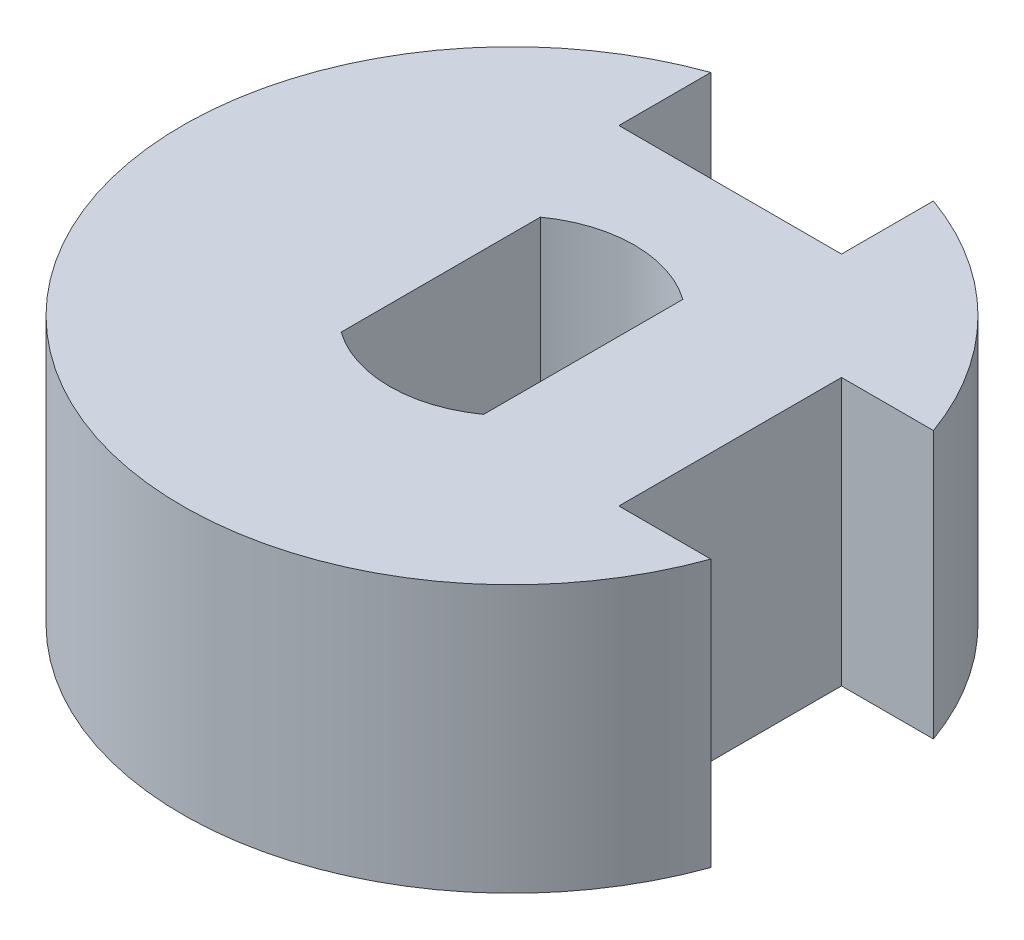
ISO-10303-21;
HEADER;
FILE_DESCRIPTION(('STEP AP214'),'2;1');
FILE_NAME('part.step','',(''),(''),'','','');
FILE_SCHEMA(('AUTOMOTIVE_DESIGN { 1 0 10303 214 1 1 1 1 }'));
ENDSEC;
DATA;
#1=APPLICATION_CONTEXT('core data for automotive mechanical design processes');
#2=APPLICATION_PROTOCOL_DEFINITION('international standard','automotive_design',2000,#1);
#3=PRODUCT_CONTEXT('',#1,'mechanical');
#4=PRODUCT('Part','Part','',(#3));
#5=PRODUCT_RELATED_PRODUCT_CATEGORY('part','',(#4));
#6=PRODUCT_DEFINITION_FORMATION('','',#4);
#7=PRODUCT_DEFINITION_CONTEXT('part definition',#1,'design');
#8=PRODUCT_DEFINITION('design','',#6,#7);
#9=PRODUCT_DEFINITION_SHAPE('','',#8);
#10=(LENGTH_UNIT() NAMED_UNIT(*) SI_UNIT(.MILLI.,.METRE.));
#11=(NAMED_UNIT(*) PLANE_ANGLE_UNIT() SI_UNIT($,.RADIAN.));
#12=(NAMED_UNIT(*) SI_UNIT($,.STERADIAN.) SOLID_ANGLE_UNIT());
#13=UNCERTAINTY_MEASURE_WITH_UNIT(LENGTH_MEASURE(1.E-05),#10,'distance_accuracy_value','');
#14=(GEOMETRIC_REPRESENTATION_CONTEXT(3) GLOBAL_UNCERTAINTY_ASSIGNED_CONTEXT((#13)) GLOBAL_UNIT_ASSIGNED_CONTEXT((#10,
#11,#12)) REPRESENTATION_CONTEXT('',''));
#15=CARTESIAN_POINT('',(0.,0.,0.));
#16=DIRECTION('',(0.,0.,1.));
#17=DIRECTION('',(1.,0.,0.));
#18=AXIS2_PLACEMENT_3D('',#15,#16,#17);
#19=CARTESIAN_POINT('',(0.,6.,-2.5));
#20=DIRECTION('',(0.,0.,-1.));
#21=DIRECTION('',(-1.,0.,0.));
#22=AXIS2_PLACEMENT_3D('',#19,#20,#21);
#23=PLANE('',#22);
#24=DIRECTION('',(1.,0.,0.));
#25=VECTOR('',#24,1.);
#26=CARTESIAN_POINT('',(0.,0.,-2.5));
#27=LINE('',#26,#25);
#28=CARTESIAN_POINT('',(4.9,0.,-2.5));
#29=VERTEX_POINT('',#28);
#30=CARTESIAN_POINT('',(6.96491205974634,0.,-2.5));
#31=VERTEX_POINT('',#30);
#32=EDGE_CURVE('E179',#29,#31,#27,.T.);
#33=ORIENTED_EDGE('',*,*,#32,.T.);
#34=DIRECTION('',(0.,-1.,0.));
#35=VECTOR('',#34,1.);
#36=CARTESIAN_POINT('',(6.96491205974634,6.,-2.5));
#37=LINE('',#36,#35);
#38=CARTESIAN_POINT('',(6.96491205974634,6.,-2.5));
#39=VERTEX_POINT('',#38);
#40=EDGE_CURVE('E11',#39,#31,#37,.T.);
#41=ORIENTED_EDGE('',*,*,#40,.F.);
#42=DIRECTION('',(1.,0.,0.));
#43=VECTOR('',#42,1.);
#44=CARTESIAN_POINT('',(0.,6.,-2.5));
#45=LINE('',#44,#43);
#46=CARTESIAN_POINT('',(4.9,6.,-2.5));
#47=VERTEX_POINT('',#46);
#48=EDGE_CURVE('E232',#47,#39,#45,.T.);
#49=ORIENTED_EDGE('',*,*,#48,.F.);
#50=DIRECTION('',(0.,-1.,0.));
#51=VECTOR('',#50,1.);
#52=CARTESIAN_POINT('',(4.9,6.,-2.5));
#53=LINE('',#52,#51);
#54=EDGE_CURVE('E58',#47,#29,#53,.T.);
#55=ORIENTED_EDGE('',*,*,#54,.T.);
#56=EDGE_LOOP('',(#33,#41,#49,#55));
#57=FACE_BOUND('',#56,.T.);
#58=ADVANCED_FACE('F39',(#57),#23,.F.);
#59=CARTESIAN_POINT('',(0.,6.,0.));
#60=DIRECTION('',(0.,-1.,0.));
#61=DIRECTION('',(0.,0.,-1.));
#62=AXIS2_PLACEMENT_3D('',#59,#60,#61);
#63=CYLINDRICAL_SURFACE('',#62,7.4);
#64=CARTESIAN_POINT('',(0.,0.,0.));
#65=DIRECTION('',(0.,1.,0.));
#66=DIRECTION('',(0.,0.,1.));
#67=AXIS2_PLACEMENT_3D('',#64,#65,#66);
#68=CIRCLE('',#67,7.4);
#69=CARTESIAN_POINT('',(2.5,0.,-6.96491205974634));
#70=VERTEX_POINT('',#69);
#71=EDGE_CURVE('E181',#31,#70,#68,.T.);
#72=ORIENTED_EDGE('',*,*,#71,.T.);
#73=DIRECTION('',(0.,-1.,0.));
#74=VECTOR('',#73,1.);
#75=CARTESIAN_POINT('',(2.5,6.,-6.96491205974634));
#76=LINE('',#75,#74);
#77=CARTESIAN_POINT('',(2.5,6.,-6.96491205974634));
#78=VERTEX_POINT('',#77);
#79=EDGE_CURVE('E49',#78,#70,#76,.T.);
#80=ORIENTED_EDGE('',*,*,#79,.F.);
#81=CARTESIAN_POINT('',(0.,6.,0.));
#82=DIRECTION('',(0.,1.,0.));
#83=DIRECTION('',(0.,0.,1.));
#84=AXIS2_PLACEMENT_3D('',#81,#82,#83);
#85=CIRCLE('',#84,7.4);
#86=EDGE_CURVE('E149',#39,#78,#85,.T.);
#87=ORIENTED_EDGE('',*,*,#86,.F.);
#88=ORIENTED_EDGE('',*,*,#40,.T.);
#89=EDGE_LOOP('',(#72,#80,#87,#88));
#90=FACE_BOUND('',#89,.T.);
#91=ADVANCED_FACE('F259',(#90),#63,.T.);
#92=CARTESIAN_POINT('',(2.5,6.,0.));
#93=DIRECTION('',(1.,0.,0.));
#94=DIRECTION('',(0.,0.,-1.));
#95=AXIS2_PLACEMENT_3D('',#92,#93,#94);
#96=PLANE('',#95);
#97=DIRECTION('',(0.,0.,1.));
#98=VECTOR('',#97,1.);
#99=CARTESIAN_POINT('',(2.5,0.,0.));
#100=LINE('',#99,#98);
#101=CARTESIAN_POINT('',(2.5,0.,-4.9));
#102=VERTEX_POINT('',#101);
#103=EDGE_CURVE('E183',#70,#102,#100,.T.);
#104=ORIENTED_EDGE('',*,*,#103,.T.);
#105=DIRECTION('',(0.,-1.,0.));
#106=VECTOR('',#105,1.);
#107=CARTESIAN_POINT('',(2.5,6.,-4.9));
#108=LINE('',#107,#106);
#109=CARTESIAN_POINT('',(2.5,6.,-4.9));
#110=VERTEX_POINT('',#109);
#111=EDGE_CURVE('E203',#110,#102,#108,.T.);
#112=ORIENTED_EDGE('',*,*,#111,.F.);
#113=DIRECTION('',(0.,0.,1.));
#114=VECTOR('',#113,1.);
#115=CARTESIAN_POINT('',(2.5,6.,0.));
#116=LINE('',#115,#114);
#117=EDGE_CURVE('E239',#78,#110,#116,.T.);
#118=ORIENTED_EDGE('',*,*,#117,.F.);
#119=ORIENTED_EDGE('',*,*,#79,.T.);
#120=EDGE_LOOP('',(#104,#112,#118,#119));
#121=FACE_BOUND('',#120,.T.);
#122=ADVANCED_FACE('F264',(#121),#96,.F.);
#123=CARTESIAN_POINT('',(0.,6.,-4.9));
#124=DIRECTION('',(0.,0.,-1.));
#125=DIRECTION('',(-1.,0.,0.));
#126=AXIS2_PLACEMENT_3D('',#123,#124,#125);
#127=PLANE('',#126);
#128=DIRECTION('',(1.,0.,0.));
#129=VECTOR('',#128,1.);
#130=CARTESIAN_POINT('',(0.,0.,-4.9));
#131=LINE('',#130,#129);
#132=CARTESIAN_POINT('',(-2.5,0.,-4.9));
#133=VERTEX_POINT('',#132);
#134=EDGE_CURVE('E186',#133,#102,#131,.T.);
#135=ORIENTED_EDGE('',*,*,#134,.F.);
#136=DIRECTION('',(0.,-1.,0.));
#137=VECTOR('',#136,1.);
#138=CARTESIAN_POINT('',(-2.5,6.,-4.9));
#139=LINE('',#138,#137);
#140=CARTESIAN_POINT('',(-2.5,6.,-4.9));
#141=VERTEX_POINT('',#140);
#142=EDGE_CURVE('E201',#141,#133,#139,.T.);
#143=ORIENTED_EDGE('',*,*,#142,.F.);
#144=DIRECTION('',(1.,0.,0.));
#145=VECTOR('',#144,1.);
#146=CARTESIAN_POINT('',(0.,6.,-4.9));
#147=LINE('',#146,#145);
#148=EDGE_CURVE('E240',#141,#110,#147,.T.);
#149=ORIENTED_EDGE('',*,*,#148,.T.);
#150=ORIENTED_EDGE('',*,*,#111,.T.);
#151=EDGE_LOOP('',(#135,#143,#149,#150));
#152=FACE_BOUND('',#151,.T.);
#153=ADVANCED_FACE('F283',(#152),#127,.T.);
#154=CARTESIAN_POINT('',(-2.5,6.,0.));
#155=DIRECTION('',(1.,0.,0.));
#156=DIRECTION('',(0.,0.,-1.));
#157=AXIS2_PLACEMENT_3D('',#154,#155,#156);
#158=PLANE('',#157);
#159=DIRECTION('',(0.,0.,1.));
#160=VECTOR('',#159,1.);
#161=CARTESIAN_POINT('',(-2.5,0.,0.));
#162=LINE('',#161,#160);
#163=CARTESIAN_POINT('',(-2.5,0.,-6.96491205974634));
#164=VERTEX_POINT('',#163);
#165=EDGE_CURVE('E189',#164,#133,#162,.T.);
#166=ORIENTED_EDGE('',*,*,#165,.F.);
#167=DIRECTION('',(0.,-1.,0.));
#168=VECTOR('',#167,1.);
#169=CARTESIAN_POINT('',(-2.5,6.,-6.96491205974634));
#170=LINE('',#169,#168);
#171=CARTESIAN_POINT('',(-2.5,6.,-6.96491205974634));
#172=VERTEX_POINT('',#171);
#173=EDGE_CURVE('E157',#172,#164,#170,.T.);
#174=ORIENTED_EDGE('',*,*,#173,.F.);
#175=DIRECTION('',(0.,0.,1.));
#176=VECTOR('',#175,1.);
#177=CARTESIAN_POINT('',(-2.5,6.,0.));
#178=LINE('',#177,#176);
#179=EDGE_CURVE('E146',#172,#141,#178,.T.);
#180=ORIENTED_EDGE('',*,*,#179,.T.);
#181=ORIENTED_EDGE('',*,*,#142,.T.);
#182=EDGE_LOOP('',(#166,#174,#180,#181));
#183=FACE_BOUND('',#182,.T.);
#184=ADVANCED_FACE('F245',(#183),#158,.T.);
#185=CARTESIAN_POINT('',(6.96491205974634,0.,2.5));
#186=VERTEX_POINT('',#185);
#187=EDGE_CURVE('E154',#164,#186,#68,.T.);
#188=ORIENTED_EDGE('',*,*,#187,.T.);
#189=DIRECTION('',(0.,-1.,0.));
#190=VECTOR('',#189,1.);
#191=CARTESIAN_POINT('',(6.96491205974634,6.,2.5));
#192=LINE('',#191,#190);
#193=CARTESIAN_POINT('',(6.96491205974634,6.,2.5));
#194=VERTEX_POINT('',#193);
#195=EDGE_CURVE('E151',#194,#186,#192,.T.);
#196=ORIENTED_EDGE('',*,*,#195,.F.);
#197=EDGE_CURVE('E137',#172,#194,#85,.T.);
#198=ORIENTED_EDGE('',*,*,#197,.F.);
#199=ORIENTED_EDGE('',*,*,#173,.T.);
#200=EDGE_LOOP('',(#188,#196,#198,#199));
#201=FACE_BOUND('',#200,.T.);
#202=ADVANCED_FACE('F152',(#201),#63,.T.);
#203=CARTESIAN_POINT('',(0.,6.,2.5));
#204=DIRECTION('',(0.,0.,-1.));
#205=DIRECTION('',(-1.,0.,0.));
#206=AXIS2_PLACEMENT_3D('',#203,#204,#205);
#207=PLANE('',#206);
#208=DIRECTION('',(1.,0.,0.));
#209=VECTOR('',#208,1.);
#210=CARTESIAN_POINT('',(0.,0.,2.5));
#211=LINE('',#210,#209);
#212=CARTESIAN_POINT('',(4.9,0.,2.5));
#213=VERTEX_POINT('',#212);
#214=EDGE_CURVE('E192',#213,#186,#211,.T.);
#215=ORIENTED_EDGE('',*,*,#214,.F.);
#216=DIRECTION('',(0.,-1.,0.));
#217=VECTOR('',#216,1.);
#218=CARTESIAN_POINT('',(4.9,6.,2.5));
#219=LINE('',#218,#217);
#220=CARTESIAN_POINT('',(4.9,6.,2.5));
#221=VERTEX_POINT('',#220);
#222=EDGE_CURVE('E96',#221,#213,#219,.T.);
#223=ORIENTED_EDGE('',*,*,#222,.F.);
#224=DIRECTION('',(1.,0.,0.));
#225=VECTOR('',#224,1.);
#226=CARTESIAN_POINT('',(0.,6.,2.5));
#227=LINE('',#226,#225);
#228=EDGE_CURVE('E143',#221,#194,#227,.T.);
#229=ORIENTED_EDGE('',*,*,#228,.T.);
#230=ORIENTED_EDGE('',*,*,#195,.T.);
#231=EDGE_LOOP('',(#215,#223,#229,#230));
#232=FACE_BOUND('',#231,.T.);
#233=ADVANCED_FACE('F159',(#232),#207,.T.);
#234=CARTESIAN_POINT('',(0.,6.,0.));
#235=DIRECTION('',(0.,-1.,0.));
#236=DIRECTION('',(0.,0.,-1.));
#237=AXIS2_PLACEMENT_3D('',#234,#235,#236);
#238=CYLINDRICAL_SURFACE('',#237,2.75);
#239=CARTESIAN_POINT('',(0.,0.,0.));
#240=DIRECTION('',(0.,1.,0.));
#241=DIRECTION('',(0.,0.,1.));
#242=AXIS2_PLACEMENT_3D('',#239,#240,#241);
#243=CIRCLE('',#242,2.75);
#244=CARTESIAN_POINT('',(-1.6,0.,2.2366269246345));
#245=VERTEX_POINT('',#244);
#246=CARTESIAN_POINT('',(1.6,0.,2.2366269246345));
#247=VERTEX_POINT('',#246);
#248=EDGE_CURVE('E167',#245,#247,#243,.T.);
#249=ORIENTED_EDGE('',*,*,#248,.F.);
#250=DIRECTION('',(0.,-1.,0.));
#251=VECTOR('',#250,1.);
#252=CARTESIAN_POINT('',(-1.6,6.,2.2366269246345));
#253=LINE('',#252,#251);
#254=CARTESIAN_POINT('',(-1.6,6.,2.2366269246345));
#255=VERTEX_POINT('',#254);
#256=EDGE_CURVE('E43',#255,#245,#253,.T.);
#257=ORIENTED_EDGE('',*,*,#256,.F.);
#258=CARTESIAN_POINT('',(0.,6.,0.));
#259=DIRECTION('',(0.,1.,0.));
#260=DIRECTION('',(0.,0.,1.));
#261=AXIS2_PLACEMENT_3D('',#258,#259,#260);
#262=CIRCLE('',#261,2.75);
#263=CARTESIAN_POINT('',(1.6,6.,2.2366269246345));
#264=VERTEX_POINT('',#263);
#265=EDGE_CURVE('E197',#255,#264,#262,.T.);
#266=ORIENTED_EDGE('',*,*,#265,.T.);
#267=DIRECTION('',(0.,-1.,0.));
#268=VECTOR('',#267,1.);
#269=CARTESIAN_POINT('',(1.6,6.,2.2366269246345));
#270=LINE('',#269,#268);
#271=EDGE_CURVE('E162',#264,#247,#270,.T.);
#272=ORIENTED_EDGE('',*,*,#271,.T.);
#273=EDGE_LOOP('',(#249,#257,#266,#272));
#274=FACE_BOUND('',#273,.T.);
#275=ADVANCED_FACE('F41',(#274),#238,.F.);
#276=CARTESIAN_POINT('',(-1.6,6.,0.));
#277=DIRECTION('',(1.,0.,0.));
#278=DIRECTION('',(0.,0.,-1.));
#279=AXIS2_PLACEMENT_3D('',#276,#277,#278);
#280=PLANE('',#279);
#281=DIRECTION('',(0.,0.,1.));
#282=VECTOR('',#281,1.);
#283=CARTESIAN_POINT('',(-1.6,0.,0.));
#284=LINE('',#283,#282);
#285=CARTESIAN_POINT('',(-1.6,0.,-2.2366269246345));
#286=VERTEX_POINT('',#285);
#287=EDGE_CURVE('E170',#286,#245,#284,.T.);
#288=ORIENTED_EDGE('',*,*,#287,.F.);
#289=DIRECTION('',(0.,-1.,0.));
#290=VECTOR('',#289,1.);
#291=CARTESIAN_POINT('',(-1.6,6.,-2.2366269246345));
#292=LINE('',#291,#290);
#293=CARTESIAN_POINT('',(-1.6,6.,-2.2366269246345));
#294=VERTEX_POINT('',#293);
#295=EDGE_CURVE('E209',#294,#286,#292,.T.);
#296=ORIENTED_EDGE('',*,*,#295,.F.);
#297=DIRECTION('',(0.,0.,1.));
#298=VECTOR('',#297,1.);
#299=CARTESIAN_POINT('',(-1.6,6.,0.));
#300=LINE('',#299,#298);
#301=EDGE_CURVE('E218',#294,#255,#300,.T.);
#302=ORIENTED_EDGE('',*,*,#301,.T.);
#303=ORIENTED_EDGE('',*,*,#256,.T.);
#304=EDGE_LOOP('',(#288,#296,#302,#303));
#305=FACE_BOUND('',#304,.T.);
#306=ADVANCED_FACE('F216',(#305),#280,.T.);
#307=CARTESIAN_POINT('',(0.,6.,0.));
#308=DIRECTION('',(0.,-1.,0.));
#309=DIRECTION('',(0.,0.,-1.));
#310=AXIS2_PLACEMENT_3D('',#307,#308,#309);
#311=CYLINDRICAL_SURFACE('',#310,2.75);
#312=CARTESIAN_POINT('',(0.,0.,0.));
#313=DIRECTION('',(0.,1.,0.));
#314=DIRECTION('',(0.,0.,1.));
#315=AXIS2_PLACEMENT_3D('',#312,#313,#314);
#316=CIRCLE('',#315,2.75);
#317=CARTESIAN_POINT('',(1.6,0.,-2.2366269246345));
#318=VERTEX_POINT('',#317);
#319=EDGE_CURVE('E173',#318,#286,#316,.T.);
#320=ORIENTED_EDGE('',*,*,#319,.F.);
#321=DIRECTION('',(0.,-1.,0.));
#322=VECTOR('',#321,1.);
#323=CARTESIAN_POINT('',(1.6,6.,-2.2366269246345));
#324=LINE('',#323,#322);
#325=CARTESIAN_POINT('',(1.6,6.,-2.2366269246345));
#326=VERTEX_POINT('',#325);
#327=EDGE_CURVE('E208',#326,#318,#324,.T.);
#328=ORIENTED_EDGE('',*,*,#327,.F.);
#329=CARTESIAN_POINT('',(0.,6.,0.));
#330=DIRECTION('',(0.,1.,0.));
#331=DIRECTION('',(0.,0.,1.));
#332=AXIS2_PLACEMENT_3D('',#329,#330,#331);
#333=CIRCLE('',#332,2.75);
#334=EDGE_CURVE('E227',#326,#294,#333,.T.);
#335=ORIENTED_EDGE('',*,*,#334,.T.);
#336=ORIENTED_EDGE('',*,*,#295,.T.);
#337=EDGE_LOOP('',(#320,#328,#335,#336));
#338=FACE_BOUND('',#337,.T.);
#339=ADVANCED_FACE('F224',(#338),#311,.F.);
#340=CARTESIAN_POINT('',(1.6,6.,0.));
#341=DIRECTION('',(1.,0.,0.));
#342=DIRECTION('',(0.,0.,-1.));
#343=AXIS2_PLACEMENT_3D('',#340,#341,#342);
#344=PLANE('',#343);
#345=DIRECTION('',(0.,0.,1.));
#346=VECTOR('',#345,1.);
#347=CARTESIAN_POINT('',(1.6,0.,0.));
#348=LINE('',#347,#346);
#349=EDGE_CURVE('E176',#318,#247,#348,.T.);
#350=ORIENTED_EDGE('',*,*,#349,.T.);
#351=ORIENTED_EDGE('',*,*,#271,.F.);
#352=DIRECTION('',(0.,0.,1.));
#353=VECTOR('',#352,1.);
#354=CARTESIAN_POINT('',(1.6,6.,0.));
#355=LINE('',#354,#353);
#356=EDGE_CURVE('E229',#326,#264,#355,.T.);
#357=ORIENTED_EDGE('',*,*,#356,.F.);
#358=ORIENTED_EDGE('',*,*,#327,.T.);
#359=EDGE_LOOP('',(#350,#351,#357,#358));
#360=FACE_BOUND('',#359,.T.);
#361=ADVANCED_FACE('F230',(#360),#344,.F.);
#362=CARTESIAN_POINT('',(4.9,6.,0.));
#363=DIRECTION('',(1.,0.,0.));
#364=DIRECTION('',(0.,0.,-1.));
#365=AXIS2_PLACEMENT_3D('',#362,#363,#364);
#366=PLANE('',#365);
#367=DIRECTION('',(0.,0.,1.));
#368=VECTOR('',#367,1.);
#369=CARTESIAN_POINT('',(4.9,0.,0.));
#370=LINE('',#369,#368);
#371=EDGE_CURVE('E194',#29,#213,#370,.T.);
#372=ORIENTED_EDGE('',*,*,#371,.F.);
#373=ORIENTED_EDGE('',*,*,#54,.F.);
#374=DIRECTION('',(0.,0.,1.));
#375=VECTOR('',#374,1.);
#376=CARTESIAN_POINT('',(4.9,6.,0.));
#377=LINE('',#376,#375);
#378=EDGE_CURVE('E160',#47,#221,#377,.T.);
#379=ORIENTED_EDGE('',*,*,#378,.T.);
#380=ORIENTED_EDGE('',*,*,#222,.T.);
#381=EDGE_LOOP('',(#372,#373,#379,#380));
#382=FACE_BOUND('',#381,.T.);
#383=ADVANCED_FACE('F247',(#382),#366,.T.);
#384=CARTESIAN_POINT('',(0.,6.,0.));
#385=DIRECTION('',(0.,1.,0.));
#386=DIRECTION('',(0.,0.,1.));
#387=AXIS2_PLACEMENT_3D('',#384,#385,#386);
#388=PLANE('',#387);
#389=ORIENTED_EDGE('',*,*,#265,.F.);
#390=ORIENTED_EDGE('',*,*,#301,.F.);
#391=ORIENTED_EDGE('',*,*,#334,.F.);
#392=ORIENTED_EDGE('',*,*,#356,.T.);
#393=EDGE_LOOP('',(#389,#390,#391,#392));
#394=FACE_BOUND('',#393,.T.);
#395=ORIENTED_EDGE('',*,*,#48,.T.);
#396=ORIENTED_EDGE('',*,*,#86,.T.);
#397=ORIENTED_EDGE('',*,*,#117,.T.);
#398=ORIENTED_EDGE('',*,*,#148,.F.);
#399=ORIENTED_EDGE('',*,*,#179,.F.);
#400=ORIENTED_EDGE('',*,*,#197,.T.);
#401=ORIENTED_EDGE('',*,*,#228,.F.);
#402=ORIENTED_EDGE('',*,*,#378,.F.);
#403=EDGE_LOOP('',(#395,#396,#397,#398,#399,#400,#401,#402));
#404=FACE_BOUND('',#403,.T.);
#405=ADVANCED_FACE('F140',(#394,#404),#388,.T.);
#406=CARTESIAN_POINT('',(0.,0.,0.));
#407=DIRECTION('',(0.,1.,0.));
#408=DIRECTION('',(0.,0.,1.));
#409=AXIS2_PLACEMENT_3D('',#406,#407,#408);
#410=PLANE('',#409);
#411=ORIENTED_EDGE('',*,*,#248,.T.);
#412=ORIENTED_EDGE('',*,*,#349,.F.);
#413=ORIENTED_EDGE('',*,*,#319,.T.);
#414=ORIENTED_EDGE('',*,*,#287,.T.);
#415=EDGE_LOOP('',(#411,#412,#413,#414));
#416=FACE_BOUND('',#415,.T.);
#417=ORIENTED_EDGE('',*,*,#32,.F.);
#418=ORIENTED_EDGE('',*,*,#371,.T.);
#419=ORIENTED_EDGE('',*,*,#214,.T.);
#420=ORIENTED_EDGE('',*,*,#187,.F.);
#421=ORIENTED_EDGE('',*,*,#165,.T.);
#422=ORIENTED_EDGE('',*,*,#134,.T.);
#423=ORIENTED_EDGE('',*,*,#103,.F.);
#424=ORIENTED_EDGE('',*,*,#71,.F.);
#425=EDGE_LOOP('',(#417,#418,#419,#420,#421,#422,#423,#424));
#426=FACE_BOUND('',#425,.T.);
#427=ADVANCED_FACE('F222',(#416,#426),#410,.F.);
#428=CLOSED_SHELL('',(#58,#91,#122,#153,#184,#202,#233,#275,#306,#339,#361,#383,#405,#427));
#429=MANIFOLD_SOLID_BREP('B2',#428);
#430=ADVANCED_BREP_SHAPE_REPRESENTATION('',(#18,#429),#14);
#431=SHAPE_DEFINITION_REPRESENTATION(#9,#430);
ENDSEC;
END-ISO-10303-21;
